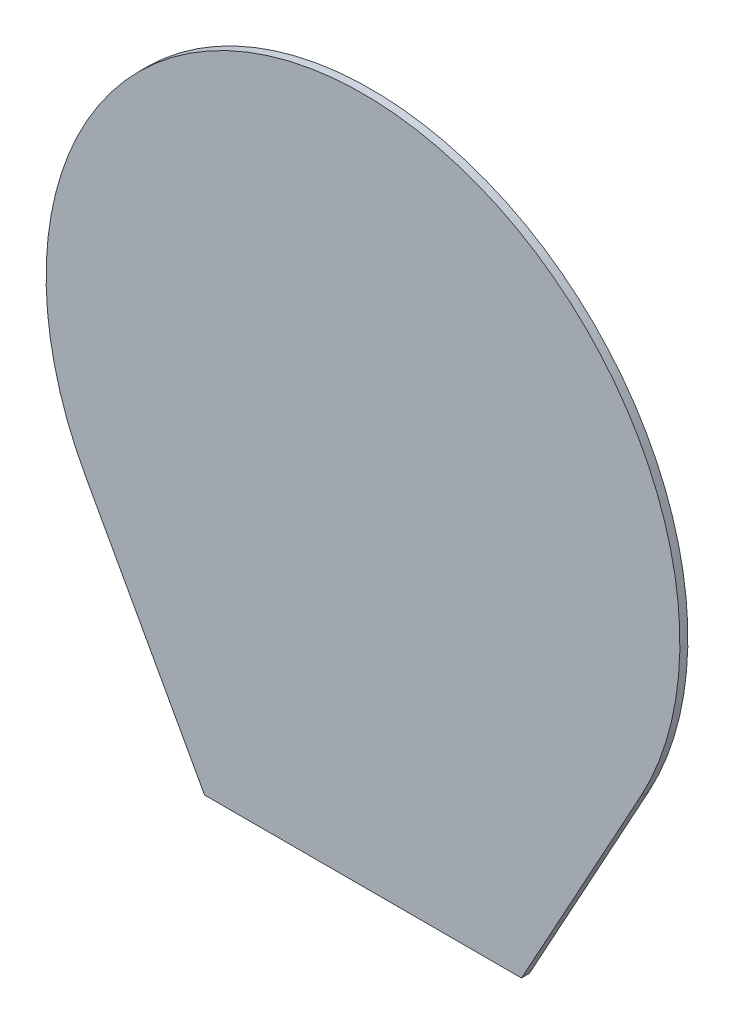
ISO-10303-21;
HEADER;
FILE_DESCRIPTION(('STEP AP214'),'2;1');
FILE_NAME('part.step','',(''),(''),'','','');
FILE_SCHEMA(('AUTOMOTIVE_DESIGN { 1 0 10303 214 1 1 1 1 }'));
ENDSEC;
DATA;
#1=APPLICATION_CONTEXT('core data for automotive mechanical design processes');
#2=APPLICATION_PROTOCOL_DEFINITION('international standard','automotive_design',2000,#1);
#3=PRODUCT_CONTEXT('',#1,'mechanical');
#4=PRODUCT('Part','Part','',(#3));
#5=PRODUCT_RELATED_PRODUCT_CATEGORY('part','',(#4));
#6=PRODUCT_DEFINITION_FORMATION('','',#4);
#7=PRODUCT_DEFINITION_CONTEXT('part definition',#1,'design');
#8=PRODUCT_DEFINITION('design','',#6,#7);
#9=PRODUCT_DEFINITION_SHAPE('','',#8);
#10=(LENGTH_UNIT() NAMED_UNIT(*) SI_UNIT(.MILLI.,.METRE.));
#11=(NAMED_UNIT(*) PLANE_ANGLE_UNIT() SI_UNIT($,.RADIAN.));
#12=(NAMED_UNIT(*) SI_UNIT($,.STERADIAN.) SOLID_ANGLE_UNIT());
#13=UNCERTAINTY_MEASURE_WITH_UNIT(LENGTH_MEASURE(1.E-05),#10,'distance_accuracy_value','');
#14=(GEOMETRIC_REPRESENTATION_CONTEXT(3) GLOBAL_UNCERTAINTY_ASSIGNED_CONTEXT((#13)) GLOBAL_UNIT_ASSIGNED_CONTEXT((#10,
#11,#12)) REPRESENTATION_CONTEXT('',''));
#15=CARTESIAN_POINT('',(0.,0.,0.));
#16=DIRECTION('',(0.,0.,1.));
#17=DIRECTION('',(1.,0.,0.));
#18=AXIS2_PLACEMENT_3D('',#15,#16,#17);
#19=CARTESIAN_POINT('',(26.2928846476366,-14.4459065795843,0.75438));
#20=DIRECTION('',(-0.876429488254551,0.481530219319478,0.));
#21=DIRECTION('',(-0.481530219319478,-0.876429488254552,0.));
#22=AXIS2_PLACEMENT_3D('',#19,#20,#21);
#23=PLANE('',#22);
#24=DIRECTION('',(0.481530219319478,0.876429488254552,0.));
#25=VECTOR('',#24,1.);
#26=CARTESIAN_POINT('',(26.2928846476366,-14.4459065795843,0.));
#27=LINE('',#26,#25);
#28=CARTESIAN_POINT('',(15.,-35.,0.));
#29=VERTEX_POINT('',#28);
#30=CARTESIAN_POINT('',(26.2928846476366,-14.4459065795843,0.));
#31=VERTEX_POINT('',#30);
#32=EDGE_CURVE('E112',#29,#31,#27,.T.);
#33=ORIENTED_EDGE('',*,*,#32,.T.);
#34=DIRECTION('',(0.,0.,-1.));
#35=VECTOR('',#34,1.);
#36=CARTESIAN_POINT('',(26.2928846476366,-14.4459065795843,0.75438));
#37=LINE('',#36,#35);
#38=CARTESIAN_POINT('',(26.2928846476366,-14.4459065795843,0.75438));
#39=VERTEX_POINT('',#38);
#40=EDGE_CURVE('E11',#39,#31,#37,.T.);
#41=ORIENTED_EDGE('',*,*,#40,.F.);
#42=DIRECTION('',(0.481530219319478,0.876429488254552,0.));
#43=VECTOR('',#42,1.);
#44=CARTESIAN_POINT('',(26.2928846476366,-14.4459065795843,0.75438));
#45=LINE('',#44,#43);
#46=CARTESIAN_POINT('',(15.,-35.,0.75438));
#47=VERTEX_POINT('',#46);
#48=EDGE_CURVE('E93',#47,#39,#45,.T.);
#49=ORIENTED_EDGE('',*,*,#48,.F.);
#50=DIRECTION('',(0.,0.,-1.));
#51=VECTOR('',#50,1.);
#52=CARTESIAN_POINT('',(15.,-35.,0.75438));
#53=LINE('',#52,#51);
#54=EDGE_CURVE('E108',#47,#29,#53,.T.);
#55=ORIENTED_EDGE('',*,*,#54,.T.);
#56=EDGE_LOOP('',(#33,#41,#49,#55));
#57=FACE_BOUND('',#56,.T.);
#58=ADVANCED_FACE('F45',(#57),#23,.F.);
#59=CARTESIAN_POINT('',(0.,0.,0.75438));
#60=DIRECTION('',(0.,0.,-1.));
#61=DIRECTION('',(-1.,0.,0.));
#62=AXIS2_PLACEMENT_3D('',#59,#60,#61);
#63=CYLINDRICAL_SURFACE('',#62,30.);
#64=CARTESIAN_POINT('',(0.,0.,0.));
#65=DIRECTION('',(0.,0.,1.));
#66=DIRECTION('',(1.,0.,0.));
#67=AXIS2_PLACEMENT_3D('',#64,#65,#66);
#68=CIRCLE('',#67,30.);
#69=CARTESIAN_POINT('',(-26.2928846476366,-14.4459065795843,0.));
#70=VERTEX_POINT('',#69);
#71=EDGE_CURVE('E99',#31,#70,#68,.T.);
#72=ORIENTED_EDGE('',*,*,#71,.T.);
#73=DIRECTION('',(0.,0.,-1.));
#74=VECTOR('',#73,1.);
#75=CARTESIAN_POINT('',(-26.2928846476366,-14.4459065795843,0.75438));
#76=LINE('',#75,#74);
#77=CARTESIAN_POINT('',(-26.2928846476366,-14.4459065795843,0.75438));
#78=VERTEX_POINT('',#77);
#79=EDGE_CURVE('E54',#78,#70,#76,.T.);
#80=ORIENTED_EDGE('',*,*,#79,.F.);
#81=CARTESIAN_POINT('',(0.,0.,0.75438));
#82=DIRECTION('',(0.,0.,1.));
#83=DIRECTION('',(1.,0.,0.));
#84=AXIS2_PLACEMENT_3D('',#81,#82,#83);
#85=CIRCLE('',#84,30.);
#86=EDGE_CURVE('E88',#39,#78,#85,.T.);
#87=ORIENTED_EDGE('',*,*,#86,.F.);
#88=ORIENTED_EDGE('',*,*,#40,.T.);
#89=EDGE_LOOP('',(#72,#80,#87,#88));
#90=FACE_BOUND('',#89,.T.);
#91=ADVANCED_FACE('F98',(#90),#63,.T.);
#92=CARTESIAN_POINT('',(-26.2928846476366,-14.4459065795843,0.75438));
#93=DIRECTION('',(-0.876429488254552,-0.481530219319478,0.));
#94=DIRECTION('',(0.481530219319478,-0.876429488254552,0.));
#95=AXIS2_PLACEMENT_3D('',#92,#93,#94);
#96=PLANE('',#95);
#97=DIRECTION('',(-0.481530219319478,0.876429488254552,0.));
#98=VECTOR('',#97,1.);
#99=CARTESIAN_POINT('',(-26.2928846476366,-14.4459065795843,0.));
#100=LINE('',#99,#98);
#101=CARTESIAN_POINT('',(-15.,-35.,0.));
#102=VERTEX_POINT('',#101);
#103=EDGE_CURVE('E118',#102,#70,#100,.T.);
#104=ORIENTED_EDGE('',*,*,#103,.F.);
#105=DIRECTION('',(0.,0.,-1.));
#106=VECTOR('',#105,1.);
#107=CARTESIAN_POINT('',(-15.,-35.,0.75438));
#108=LINE('',#107,#106);
#109=CARTESIAN_POINT('',(-15.,-35.,0.75438));
#110=VERTEX_POINT('',#109);
#111=EDGE_CURVE('E78',#110,#102,#108,.T.);
#112=ORIENTED_EDGE('',*,*,#111,.F.);
#113=DIRECTION('',(-0.481530219319478,0.876429488254552,0.));
#114=VECTOR('',#113,1.);
#115=CARTESIAN_POINT('',(-26.2928846476366,-14.4459065795843,0.75438));
#116=LINE('',#115,#114);
#117=EDGE_CURVE('E91',#110,#78,#116,.T.);
#118=ORIENTED_EDGE('',*,*,#117,.T.);
#119=ORIENTED_EDGE('',*,*,#79,.T.);
#120=EDGE_LOOP('',(#104,#112,#118,#119));
#121=FACE_BOUND('',#120,.T.);
#122=ADVANCED_FACE('F104',(#121),#96,.T.);
#123=CARTESIAN_POINT('',(0.,-35.,0.75438));
#124=DIRECTION('',(0.,1.,0.));
#125=DIRECTION('',(0.,0.,1.));
#126=AXIS2_PLACEMENT_3D('',#123,#124,#125);
#127=PLANE('',#126);
#128=DIRECTION('',(1.,0.,0.));
#129=VECTOR('',#128,1.);
#130=CARTESIAN_POINT('',(0.,-35.,0.));
#131=LINE('',#130,#129);
#132=EDGE_CURVE('E81',#102,#29,#131,.T.);
#133=ORIENTED_EDGE('',*,*,#132,.T.);
#134=ORIENTED_EDGE('',*,*,#54,.F.);
#135=DIRECTION('',(1.,0.,0.));
#136=VECTOR('',#135,1.);
#137=CARTESIAN_POINT('',(0.,-35.,0.75438));
#138=LINE('',#137,#136);
#139=EDGE_CURVE('E62',#110,#47,#138,.T.);
#140=ORIENTED_EDGE('',*,*,#139,.F.);
#141=ORIENTED_EDGE('',*,*,#111,.T.);
#142=EDGE_LOOP('',(#133,#134,#140,#141));
#143=FACE_BOUND('',#142,.T.);
#144=ADVANCED_FACE('F135',(#143),#127,.F.);
#145=CARTESIAN_POINT('',(0.,0.,0.75438));
#146=DIRECTION('',(0.,0.,1.));
#147=DIRECTION('',(1.,0.,0.));
#148=AXIS2_PLACEMENT_3D('',#145,#146,#147);
#149=PLANE('',#148);
#150=ORIENTED_EDGE('',*,*,#48,.T.);
#151=ORIENTED_EDGE('',*,*,#86,.T.);
#152=ORIENTED_EDGE('',*,*,#117,.F.);
#153=ORIENTED_EDGE('',*,*,#139,.T.);
#154=EDGE_LOOP('',(#150,#151,#152,#153));
#155=FACE_BOUND('',#154,.T.);
#156=ADVANCED_FACE('F89',(#155),#149,.T.);
#157=CARTESIAN_POINT('',(0.,0.,0.));
#158=DIRECTION('',(0.,0.,1.));
#159=DIRECTION('',(1.,0.,0.));
#160=AXIS2_PLACEMENT_3D('',#157,#158,#159);
#161=PLANE('',#160);
#162=ORIENTED_EDGE('',*,*,#32,.F.);
#163=ORIENTED_EDGE('',*,*,#132,.F.);
#164=ORIENTED_EDGE('',*,*,#103,.T.);
#165=ORIENTED_EDGE('',*,*,#71,.F.);
#166=EDGE_LOOP('',(#162,#163,#164,#165));
#167=FACE_BOUND('',#166,.T.);
#168=ADVANCED_FACE('F129',(#167),#161,.F.);
#169=CLOSED_SHELL('',(#58,#91,#122,#144,#156,#168));
#170=MANIFOLD_SOLID_BREP('B2',#169);
#171=ADVANCED_BREP_SHAPE_REPRESENTATION('',(#18,#170),#14);
#172=SHAPE_DEFINITION_REPRESENTATION(#9,#171);
ENDSEC;
END-ISO-10303-21;
